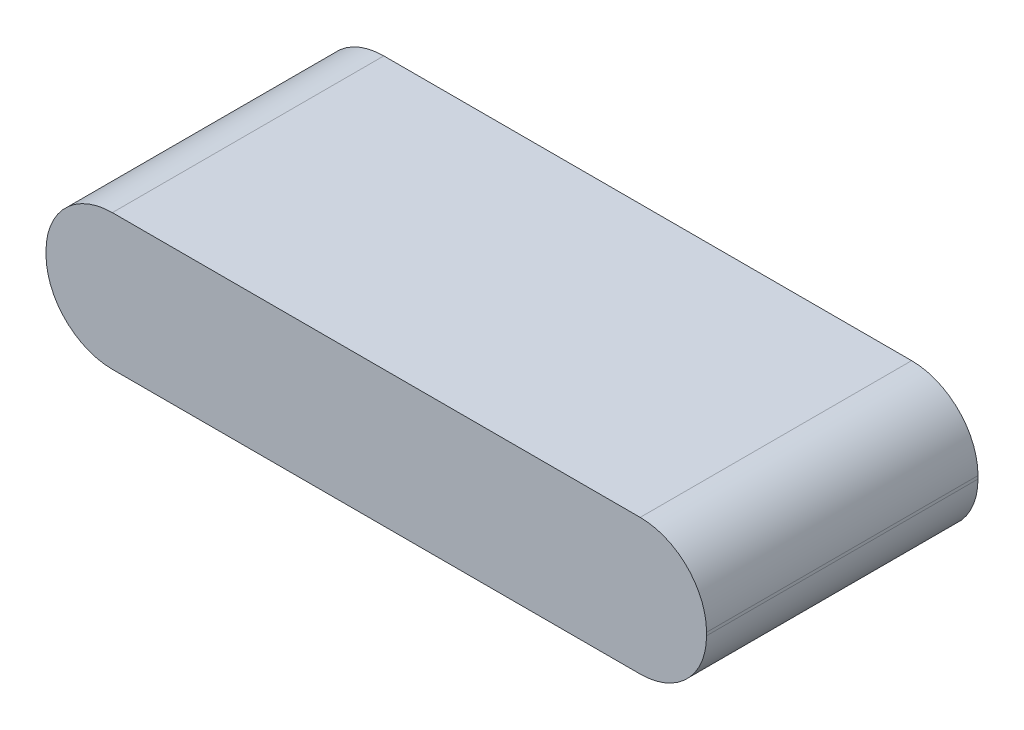
ISO-10303-21;
HEADER;
FILE_DESCRIPTION(('STEP AP214'),'2;1');
FILE_NAME('part.step','',(''),(''),'','','');
FILE_SCHEMA(('AUTOMOTIVE_DESIGN { 1 0 10303 214 1 1 1 1 }'));
ENDSEC;
DATA;
#1=APPLICATION_CONTEXT('core data for automotive mechanical design processes');
#2=APPLICATION_PROTOCOL_DEFINITION('international standard','automotive_design',2000,#1);
#3=PRODUCT_CONTEXT('',#1,'mechanical');
#4=PRODUCT('Part','Part','',(#3));
#5=PRODUCT_RELATED_PRODUCT_CATEGORY('part','',(#4));
#6=PRODUCT_DEFINITION_FORMATION('','',#4);
#7=PRODUCT_DEFINITION_CONTEXT('part definition',#1,'design');
#8=PRODUCT_DEFINITION('design','',#6,#7);
#9=PRODUCT_DEFINITION_SHAPE('','',#8);
#10=(LENGTH_UNIT() NAMED_UNIT(*) SI_UNIT(.MILLI.,.METRE.));
#11=(NAMED_UNIT(*) PLANE_ANGLE_UNIT() SI_UNIT($,.RADIAN.));
#12=(NAMED_UNIT(*) SI_UNIT($,.STERADIAN.) SOLID_ANGLE_UNIT());
#13=UNCERTAINTY_MEASURE_WITH_UNIT(LENGTH_MEASURE(1.E-05),#10,'distance_accuracy_value','');
#14=(GEOMETRIC_REPRESENTATION_CONTEXT(3) GLOBAL_UNCERTAINTY_ASSIGNED_CONTEXT((#13)) GLOBAL_UNIT_ASSIGNED_CONTEXT((#10,
#11,#12)) REPRESENTATION_CONTEXT('',''));
#15=CARTESIAN_POINT('',(0.,0.,0.));
#16=DIRECTION('',(0.,0.,1.));
#17=DIRECTION('',(1.,0.,0.));
#18=AXIS2_PLACEMENT_3D('',#15,#16,#17);
#19=CARTESIAN_POINT('',(0.,22.86,0.));
#20=DIRECTION('',(1.,0.,0.));
#21=DIRECTION('',(0.,0.,-1.));
#22=AXIS2_PLACEMENT_3D('',#19,#20,#21);
#23=PLANE('',#22);
#24=DIRECTION('',(0.,-1.,0.));
#25=VECTOR('',#24,1.);
#26=CARTESIAN_POINT('',(0.,22.86,-45.72));
#27=LINE('',#26,#25);
#28=CARTESIAN_POINT('',(0.,11.684,-45.72));
#29=VERTEX_POINT('',#28);
#30=CARTESIAN_POINT('',(0.,11.176,-45.72));
#31=VERTEX_POINT('',#30);
#32=EDGE_CURVE('E123',#29,#31,#27,.T.);
#33=ORIENTED_EDGE('',*,*,#32,.T.);
#34=DIRECTION('',(0.,0.,1.));
#35=VECTOR('',#34,1.);
#36=CARTESIAN_POINT('',(0.,11.176,0.));
#37=LINE('',#36,#35);
#38=CARTESIAN_POINT('',(0.,11.176,0.));
#39=VERTEX_POINT('',#38);
#40=EDGE_CURVE('E11',#31,#39,#37,.T.);
#41=ORIENTED_EDGE('',*,*,#40,.T.);
#42=DIRECTION('',(0.,-1.,0.));
#43=VECTOR('',#42,1.);
#44=CARTESIAN_POINT('',(0.,22.86,0.));
#45=LINE('',#44,#43);
#46=CARTESIAN_POINT('',(0.,11.684,0.));
#47=VERTEX_POINT('',#46);
#48=EDGE_CURVE('E128',#47,#39,#45,.T.);
#49=ORIENTED_EDGE('',*,*,#48,.F.);
#50=DIRECTION('',(0.,0.,1.));
#51=VECTOR('',#50,1.);
#52=CARTESIAN_POINT('',(0.,11.684,0.));
#53=LINE('',#52,#51);
#54=EDGE_CURVE('E43',#47,#29,#53,.F.);
#55=ORIENTED_EDGE('',*,*,#54,.T.);
#56=EDGE_LOOP('',(#33,#41,#49,#55));
#57=FACE_BOUND('',#56,.T.);
#58=ADVANCED_FACE('F35',(#57),#23,.F.);
#59=CARTESIAN_POINT('',(0.,22.86,0.));
#60=DIRECTION('',(0.,0.,-1.));
#61=DIRECTION('',(-1.,0.,0.));
#62=AXIS2_PLACEMENT_3D('',#59,#60,#61);
#63=PLANE('',#62);
#64=DIRECTION('',(1.,0.,0.));
#65=VECTOR('',#64,1.);
#66=CARTESIAN_POINT('',(0.,0.,0.));
#67=LINE('',#66,#65);
#68=CARTESIAN_POINT('',(11.176,0.,0.));
#69=VERTEX_POINT('',#68);
#70=CARTESIAN_POINT('',(100.076,0.,0.));
#71=VERTEX_POINT('',#70);
#72=EDGE_CURVE('E170',#69,#71,#67,.T.);
#73=ORIENTED_EDGE('',*,*,#72,.T.);
#74=CARTESIAN_POINT('',(100.076,11.176,0.));
#75=DIRECTION('',(0.,0.,-1.));
#76=DIRECTION('',(-1.,0.,0.));
#77=AXIS2_PLACEMENT_3D('',#74,#75,#76);
#78=CIRCLE('',#77,11.176);
#79=CARTESIAN_POINT('',(111.252,11.176,0.));
#80=VERTEX_POINT('',#79);
#81=EDGE_CURVE('E145',#71,#80,#78,.F.);
#82=ORIENTED_EDGE('',*,*,#81,.T.);
#83=DIRECTION('',(0.,-1.,0.));
#84=VECTOR('',#83,1.);
#85=CARTESIAN_POINT('',(111.252,22.86,0.));
#86=LINE('',#85,#84);
#87=CARTESIAN_POINT('',(111.252,11.684,0.));
#88=VERTEX_POINT('',#87);
#89=EDGE_CURVE('E122',#88,#80,#86,.T.);
#90=ORIENTED_EDGE('',*,*,#89,.F.);
#91=CARTESIAN_POINT('',(100.076,11.684,0.));
#92=DIRECTION('',(0.,0.,-1.));
#93=DIRECTION('',(-1.,0.,0.));
#94=AXIS2_PLACEMENT_3D('',#91,#92,#93);
#95=CIRCLE('',#94,11.176);
#96=CARTESIAN_POINT('',(100.076,22.86,0.));
#97=VERTEX_POINT('',#96);
#98=EDGE_CURVE('E127',#88,#97,#95,.F.);
#99=ORIENTED_EDGE('',*,*,#98,.T.);
#100=DIRECTION('',(1.,0.,0.));
#101=VECTOR('',#100,1.);
#102=CARTESIAN_POINT('',(0.,22.86,0.));
#103=LINE('',#102,#101);
#104=CARTESIAN_POINT('',(11.176,22.86,0.));
#105=VERTEX_POINT('',#104);
#106=EDGE_CURVE('E164',#105,#97,#103,.T.);
#107=ORIENTED_EDGE('',*,*,#106,.F.);
#108=CARTESIAN_POINT('',(11.176,11.684,0.));
#109=DIRECTION('',(0.,0.,-1.));
#110=DIRECTION('',(-1.,0.,0.));
#111=AXIS2_PLACEMENT_3D('',#108,#109,#110);
#112=CIRCLE('',#111,11.176);
#113=EDGE_CURVE('E57',#105,#47,#112,.F.);
#114=ORIENTED_EDGE('',*,*,#113,.T.);
#115=ORIENTED_EDGE('',*,*,#48,.T.);
#116=CARTESIAN_POINT('',(11.176,11.176,0.));
#117=DIRECTION('',(0.,0.,-1.));
#118=DIRECTION('',(-1.,0.,0.));
#119=AXIS2_PLACEMENT_3D('',#116,#117,#118);
#120=CIRCLE('',#119,11.176);
#121=EDGE_CURVE('E50',#39,#69,#120,.F.);
#122=ORIENTED_EDGE('',*,*,#121,.T.);
#123=EDGE_LOOP('',(#73,#82,#90,#99,#107,#114,#115,#122));
#124=FACE_BOUND('',#123,.T.);
#125=ADVANCED_FACE('F166',(#124),#63,.F.);
#126=CARTESIAN_POINT('',(111.252,22.86,0.));
#127=DIRECTION('',(-1.,0.,0.));
#128=DIRECTION('',(0.,0.,1.));
#129=AXIS2_PLACEMENT_3D('',#126,#127,#128);
#130=PLANE('',#129);
#131=ORIENTED_EDGE('',*,*,#89,.T.);
#132=DIRECTION('',(0.,0.,-1.));
#133=VECTOR('',#132,1.);
#134=CARTESIAN_POINT('',(111.252,11.176,-45.72));
#135=LINE('',#134,#133);
#136=CARTESIAN_POINT('',(111.252,11.176,-45.72));
#137=VERTEX_POINT('',#136);
#138=EDGE_CURVE('E121',#80,#137,#135,.T.);
#139=ORIENTED_EDGE('',*,*,#138,.T.);
#140=DIRECTION('',(0.,-1.,0.));
#141=VECTOR('',#140,1.);
#142=CARTESIAN_POINT('',(111.252,22.86,-45.72));
#143=LINE('',#142,#141);
#144=CARTESIAN_POINT('',(111.252,11.684,-45.72));
#145=VERTEX_POINT('',#144);
#146=EDGE_CURVE('E104',#145,#137,#143,.T.);
#147=ORIENTED_EDGE('',*,*,#146,.F.);
#148=DIRECTION('',(0.,0.,-1.));
#149=VECTOR('',#148,1.);
#150=CARTESIAN_POINT('',(111.252,11.684,0.));
#151=LINE('',#150,#149);
#152=EDGE_CURVE('E118',#145,#88,#151,.F.);
#153=ORIENTED_EDGE('',*,*,#152,.T.);
#154=EDGE_LOOP('',(#131,#139,#147,#153));
#155=FACE_BOUND('',#154,.T.);
#156=ADVANCED_FACE('F117',(#155),#130,.F.);
#157=CARTESIAN_POINT('',(0.,22.86,-45.72));
#158=DIRECTION('',(0.,0.,1.));
#159=DIRECTION('',(1.,0.,0.));
#160=AXIS2_PLACEMENT_3D('',#157,#158,#159);
#161=PLANE('',#160);
#162=ORIENTED_EDGE('',*,*,#146,.T.);
#163=CARTESIAN_POINT('',(100.076,11.176,-45.72));
#164=DIRECTION('',(0.,0.,1.));
#165=DIRECTION('',(1.,0.,0.));
#166=AXIS2_PLACEMENT_3D('',#163,#164,#165);
#167=CIRCLE('',#166,11.176);
#168=CARTESIAN_POINT('',(100.076,0.,-45.72));
#169=VERTEX_POINT('',#168);
#170=EDGE_CURVE('E111',#137,#169,#167,.F.);
#171=ORIENTED_EDGE('',*,*,#170,.T.);
#172=DIRECTION('',(-1.,0.,0.));
#173=VECTOR('',#172,1.);
#174=CARTESIAN_POINT('',(0.,0.,-45.72));
#175=LINE('',#174,#173);
#176=CARTESIAN_POINT('',(11.176,0.,-45.72));
#177=VERTEX_POINT('',#176);
#178=EDGE_CURVE('E167',#169,#177,#175,.T.);
#179=ORIENTED_EDGE('',*,*,#178,.T.);
#180=CARTESIAN_POINT('',(11.176,11.176,-45.72));
#181=DIRECTION('',(0.,0.,1.));
#182=DIRECTION('',(1.,0.,0.));
#183=AXIS2_PLACEMENT_3D('',#180,#181,#182);
#184=CIRCLE('',#183,11.176);
#185=EDGE_CURVE('E112',#177,#31,#184,.F.);
#186=ORIENTED_EDGE('',*,*,#185,.T.);
#187=ORIENTED_EDGE('',*,*,#32,.F.);
#188=CARTESIAN_POINT('',(11.176,11.684,-45.72));
#189=DIRECTION('',(0.,0.,1.));
#190=DIRECTION('',(1.,0.,0.));
#191=AXIS2_PLACEMENT_3D('',#188,#189,#190);
#192=CIRCLE('',#191,11.176);
#193=CARTESIAN_POINT('',(11.176,22.86,-45.72));
#194=VERTEX_POINT('',#193);
#195=EDGE_CURVE('E130',#29,#194,#192,.F.);
#196=ORIENTED_EDGE('',*,*,#195,.T.);
#197=DIRECTION('',(-1.,0.,0.));
#198=VECTOR('',#197,1.);
#199=CARTESIAN_POINT('',(0.,22.86,-45.72));
#200=LINE('',#199,#198);
#201=CARTESIAN_POINT('',(100.076,22.86,-45.72));
#202=VERTEX_POINT('',#201);
#203=EDGE_CURVE('E106',#202,#194,#200,.T.);
#204=ORIENTED_EDGE('',*,*,#203,.F.);
#205=CARTESIAN_POINT('',(100.076,11.684,-45.72));
#206=DIRECTION('',(0.,0.,1.));
#207=DIRECTION('',(1.,0.,0.));
#208=AXIS2_PLACEMENT_3D('',#205,#206,#207);
#209=CIRCLE('',#208,11.176);
#210=EDGE_CURVE('E101',#202,#145,#209,.F.);
#211=ORIENTED_EDGE('',*,*,#210,.T.);
#212=EDGE_LOOP('',(#162,#171,#179,#186,#187,#196,#204,#211));
#213=FACE_BOUND('',#212,.T.);
#214=ADVANCED_FACE('F103',(#213),#161,.F.);
#215=CARTESIAN_POINT('',(0.,22.86,0.));
#216=DIRECTION('',(0.,-1.,0.));
#217=DIRECTION('',(0.,0.,-1.));
#218=AXIS2_PLACEMENT_3D('',#215,#216,#217);
#219=PLANE('',#218);
#220=ORIENTED_EDGE('',*,*,#106,.T.);
#221=DIRECTION('',(0.,0.,-1.));
#222=VECTOR('',#221,1.);
#223=CARTESIAN_POINT('',(100.076,22.86,0.));
#224=LINE('',#223,#222);
#225=EDGE_CURVE('E150',#97,#202,#224,.T.);
#226=ORIENTED_EDGE('',*,*,#225,.T.);
#227=ORIENTED_EDGE('',*,*,#203,.T.);
#228=DIRECTION('',(0.,0.,1.));
#229=VECTOR('',#228,1.);
#230=CARTESIAN_POINT('',(11.176,22.86,0.));
#231=LINE('',#230,#229);
#232=EDGE_CURVE('E147',#194,#105,#231,.T.);
#233=ORIENTED_EDGE('',*,*,#232,.T.);
#234=EDGE_LOOP('',(#220,#226,#227,#233));
#235=FACE_BOUND('',#234,.T.);
#236=ADVANCED_FACE('F163',(#235),#219,.F.);
#237=CARTESIAN_POINT('',(0.,0.,0.));
#238=DIRECTION('',(0.,-1.,0.));
#239=DIRECTION('',(0.,0.,-1.));
#240=AXIS2_PLACEMENT_3D('',#237,#238,#239);
#241=PLANE('',#240);
#242=ORIENTED_EDGE('',*,*,#178,.F.);
#243=DIRECTION('',(0.,0.,-1.));
#244=VECTOR('',#243,1.);
#245=CARTESIAN_POINT('',(100.076,0.,0.));
#246=LINE('',#245,#244);
#247=EDGE_CURVE('E140',#169,#71,#246,.F.);
#248=ORIENTED_EDGE('',*,*,#247,.T.);
#249=ORIENTED_EDGE('',*,*,#72,.F.);
#250=DIRECTION('',(0.,0.,1.));
#251=VECTOR('',#250,1.);
#252=CARTESIAN_POINT('',(11.176,0.,-45.72));
#253=LINE('',#252,#251);
#254=EDGE_CURVE('E138',#69,#177,#253,.F.);
#255=ORIENTED_EDGE('',*,*,#254,.T.);
#256=EDGE_LOOP('',(#242,#248,#249,#255));
#257=FACE_BOUND('',#256,.T.);
#258=ADVANCED_FACE('F179',(#257),#241,.T.);
#259=CARTESIAN_POINT('',(100.076,11.176,0.));
#260=DIRECTION('',(0.,0.,1.));
#261=DIRECTION('',(1.,0.,0.));
#262=AXIS2_PLACEMENT_3D('',#259,#260,#261);
#263=CYLINDRICAL_SURFACE('',#262,11.176);
#264=ORIENTED_EDGE('',*,*,#81,.F.);
#265=ORIENTED_EDGE('',*,*,#247,.F.);
#266=ORIENTED_EDGE('',*,*,#170,.F.);
#267=ORIENTED_EDGE('',*,*,#138,.F.);
#268=EDGE_LOOP('',(#264,#265,#266,#267));
#269=FACE_BOUND('',#268,.T.);
#270=ADVANCED_FACE('F175',(#269),#263,.T.);
#271=CARTESIAN_POINT('',(100.076,11.684,0.));
#272=DIRECTION('',(0.,0.,-1.));
#273=DIRECTION('',(-1.,0.,0.));
#274=AXIS2_PLACEMENT_3D('',#271,#272,#273);
#275=CYLINDRICAL_SURFACE('',#274,11.176);
#276=ORIENTED_EDGE('',*,*,#98,.F.);
#277=ORIENTED_EDGE('',*,*,#152,.F.);
#278=ORIENTED_EDGE('',*,*,#210,.F.);
#279=ORIENTED_EDGE('',*,*,#225,.F.);
#280=EDGE_LOOP('',(#276,#277,#278,#279));
#281=FACE_BOUND('',#280,.T.);
#282=ADVANCED_FACE('F126',(#281),#275,.T.);
#283=CARTESIAN_POINT('',(11.176,11.176,0.));
#284=DIRECTION('',(0.,0.,-1.));
#285=DIRECTION('',(-1.,0.,0.));
#286=AXIS2_PLACEMENT_3D('',#283,#284,#285);
#287=CYLINDRICAL_SURFACE('',#286,11.176);
#288=ORIENTED_EDGE('',*,*,#185,.F.);
#289=ORIENTED_EDGE('',*,*,#254,.F.);
#290=ORIENTED_EDGE('',*,*,#121,.F.);
#291=ORIENTED_EDGE('',*,*,#40,.F.);
#292=EDGE_LOOP('',(#288,#289,#290,#291));
#293=FACE_BOUND('',#292,.T.);
#294=ADVANCED_FACE('F181',(#293),#287,.T.);
#295=CARTESIAN_POINT('',(11.176,11.684,0.));
#296=DIRECTION('',(0.,0.,1.));
#297=DIRECTION('',(1.,0.,0.));
#298=AXIS2_PLACEMENT_3D('',#295,#296,#297);
#299=CYLINDRICAL_SURFACE('',#298,11.176);
#300=ORIENTED_EDGE('',*,*,#195,.F.);
#301=ORIENTED_EDGE('',*,*,#54,.F.);
#302=ORIENTED_EDGE('',*,*,#113,.F.);
#303=ORIENTED_EDGE('',*,*,#232,.F.);
#304=EDGE_LOOP('',(#300,#301,#302,#303));
#305=FACE_BOUND('',#304,.T.);
#306=ADVANCED_FACE('F37',(#305),#299,.T.);
#307=CLOSED_SHELL('',(#58,#125,#156,#214,#236,#258,#270,#282,#294,#306));
#308=MANIFOLD_SOLID_BREP('B2',#307);
#309=ADVANCED_BREP_SHAPE_REPRESENTATION('',(#18,#308),#14);
#310=SHAPE_DEFINITION_REPRESENTATION(#9,#309);
ENDSEC;
END-ISO-10303-21;
